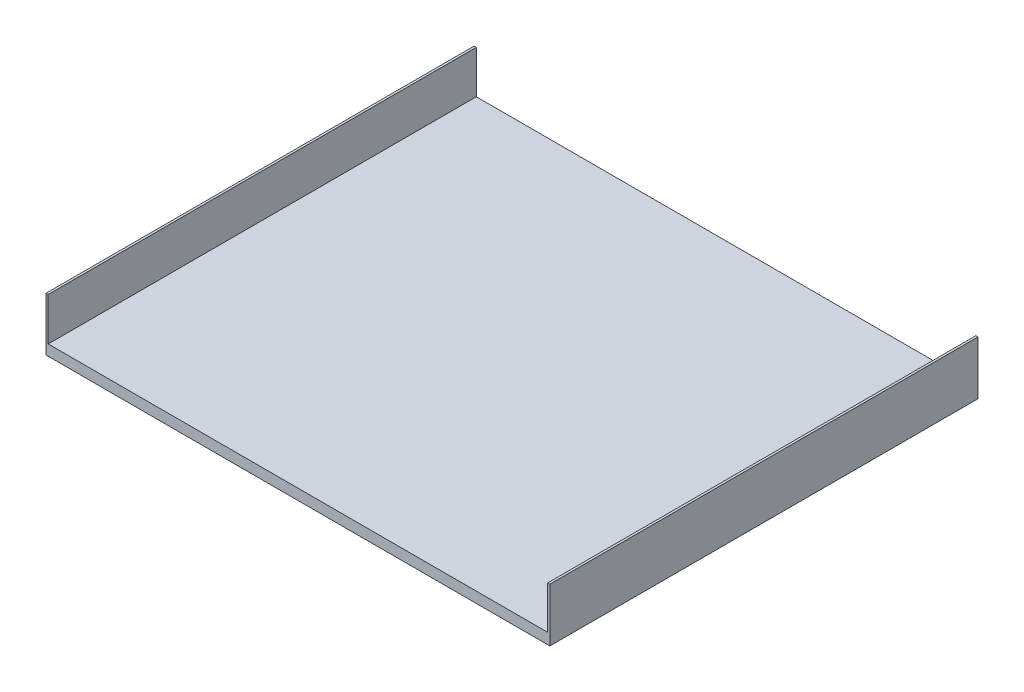
ISO-10303-21;
HEADER;
FILE_DESCRIPTION(('STEP AP214'),'2;1');
FILE_NAME('part.step','',(''),(''),'','','');
FILE_SCHEMA(('AUTOMOTIVE_DESIGN { 1 0 10303 214 1 1 1 1 }'));
ENDSEC;
DATA;
#1=APPLICATION_CONTEXT('core data for automotive mechanical design processes');
#2=APPLICATION_PROTOCOL_DEFINITION('international standard','automotive_design',2000,#1);
#3=PRODUCT_CONTEXT('',#1,'mechanical');
#4=PRODUCT('Part','Part','',(#3));
#5=PRODUCT_RELATED_PRODUCT_CATEGORY('part','',(#4));
#6=PRODUCT_DEFINITION_FORMATION('','',#4);
#7=PRODUCT_DEFINITION_CONTEXT('part definition',#1,'design');
#8=PRODUCT_DEFINITION('design','',#6,#7);
#9=PRODUCT_DEFINITION_SHAPE('','',#8);
#10=(LENGTH_UNIT() NAMED_UNIT(*) SI_UNIT(.MILLI.,.METRE.));
#11=(NAMED_UNIT(*) PLANE_ANGLE_UNIT() SI_UNIT($,.RADIAN.));
#12=(NAMED_UNIT(*) SI_UNIT($,.STERADIAN.) SOLID_ANGLE_UNIT());
#13=UNCERTAINTY_MEASURE_WITH_UNIT(LENGTH_MEASURE(1.E-05),#10,'distance_accuracy_value','');
#14=(GEOMETRIC_REPRESENTATION_CONTEXT(3) GLOBAL_UNCERTAINTY_ASSIGNED_CONTEXT((#13)) GLOBAL_UNIT_ASSIGNED_CONTEXT((#10,
#11,#12)) REPRESENTATION_CONTEXT('',''));
#15=CARTESIAN_POINT('',(0.,0.,0.));
#16=DIRECTION('',(0.,0.,1.));
#17=DIRECTION('',(1.,0.,0.));
#18=AXIS2_PLACEMENT_3D('',#15,#16,#17);
#19=CARTESIAN_POINT('',(0.,-15.,300.));
#20=DIRECTION('',(0.,1.,0.));
#21=DIRECTION('',(0.,0.,1.));
#22=AXIS2_PLACEMENT_3D('',#19,#20,#21);
#23=PLANE('',#22);
#24=DIRECTION('',(1.,0.,0.));
#25=VECTOR('',#24,1.);
#26=CARTESIAN_POINT('',(0.,-15.,-300.));
#27=LINE('',#26,#25);
#28=CARTESIAN_POINT('',(-353.0625,-15.,-300.));
#29=VERTEX_POINT('',#28);
#30=CARTESIAN_POINT('',(353.0625,-15.,-300.));
#31=VERTEX_POINT('',#30);
#32=EDGE_CURVE('E131',#29,#31,#27,.T.);
#33=ORIENTED_EDGE('',*,*,#32,.T.);
#34=DIRECTION('',(0.,0.,-1.));
#35=VECTOR('',#34,1.);
#36=CARTESIAN_POINT('',(353.0625,-15.,300.));
#37=LINE('',#36,#35);
#38=CARTESIAN_POINT('',(353.0625,-15.,300.));
#39=VERTEX_POINT('',#38);
#40=EDGE_CURVE('E11',#39,#31,#37,.T.);
#41=ORIENTED_EDGE('',*,*,#40,.F.);
#42=DIRECTION('',(1.,0.,0.));
#43=VECTOR('',#42,1.);
#44=CARTESIAN_POINT('',(0.,-15.,300.));
#45=LINE('',#44,#43);
#46=CARTESIAN_POINT('',(-353.0625,-15.,300.));
#47=VERTEX_POINT('',#46);
#48=EDGE_CURVE('E91',#47,#39,#45,.T.);
#49=ORIENTED_EDGE('',*,*,#48,.F.);
#50=DIRECTION('',(0.,0.,-1.));
#51=VECTOR('',#50,1.);
#52=CARTESIAN_POINT('',(-353.0625,-15.,300.));
#53=LINE('',#52,#51);
#54=EDGE_CURVE('E127',#47,#29,#53,.T.);
#55=ORIENTED_EDGE('',*,*,#54,.T.);
#56=EDGE_LOOP('',(#33,#41,#49,#55));
#57=FACE_BOUND('',#56,.T.);
#58=ADVANCED_FACE('F35',(#57),#23,.F.);
#59=CARTESIAN_POINT('',(353.0625,2.61318744421146E-13,300.));
#60=DIRECTION('',(1.,0.,0.));
#61=DIRECTION('',(0.,1.,0.));
#62=AXIS2_PLACEMENT_3D('',#59,#60,#61);
#63=PLANE('',#62);
#64=DIRECTION('',(0.,-1.,0.));
#65=VECTOR('',#64,1.);
#66=CARTESIAN_POINT('',(353.0625,2.61318744421146E-13,-300.));
#67=LINE('',#66,#65);
#68=CARTESIAN_POINT('',(353.0625,60.,-300.));
#69=VERTEX_POINT('',#68);
#70=EDGE_CURVE('E134',#69,#31,#67,.T.);
#71=ORIENTED_EDGE('',*,*,#70,.F.);
#72=DIRECTION('',(0.,0.,-1.));
#73=VECTOR('',#72,1.);
#74=CARTESIAN_POINT('',(353.0625,60.,300.));
#75=LINE('',#74,#73);
#76=CARTESIAN_POINT('',(353.0625,60.,300.));
#77=VERTEX_POINT('',#76);
#78=EDGE_CURVE('E43',#77,#69,#75,.T.);
#79=ORIENTED_EDGE('',*,*,#78,.F.);
#80=DIRECTION('',(0.,-1.,0.));
#81=VECTOR('',#80,1.);
#82=CARTESIAN_POINT('',(353.0625,2.61318744421146E-13,300.));
#83=LINE('',#82,#81);
#84=EDGE_CURVE('E173',#77,#39,#83,.T.);
#85=ORIENTED_EDGE('',*,*,#84,.T.);
#86=ORIENTED_EDGE('',*,*,#40,.T.);
#87=EDGE_LOOP('',(#71,#79,#85,#86));
#88=FACE_BOUND('',#87,.T.);
#89=ADVANCED_FACE('F163',(#88),#63,.T.);
#90=CARTESIAN_POINT('',(0.,60.,300.));
#91=DIRECTION('',(0.,1.,0.));
#92=DIRECTION('',(0.,0.,1.));
#93=AXIS2_PLACEMENT_3D('',#90,#91,#92);
#94=PLANE('',#93);
#95=DIRECTION('',(1.,0.,0.));
#96=VECTOR('',#95,1.);
#97=CARTESIAN_POINT('',(0.,60.,-300.));
#98=LINE('',#97,#96);
#99=CARTESIAN_POINT('',(350.,60.,-300.));
#100=VERTEX_POINT('',#99);
#101=EDGE_CURVE('E137',#100,#69,#98,.T.);
#102=ORIENTED_EDGE('',*,*,#101,.F.);
#103=DIRECTION('',(0.,0.,-1.));
#104=VECTOR('',#103,1.);
#105=CARTESIAN_POINT('',(350.,60.,300.));
#106=LINE('',#105,#104);
#107=CARTESIAN_POINT('',(350.,60.,300.));
#108=VERTEX_POINT('',#107);
#109=EDGE_CURVE('E153',#108,#100,#106,.T.);
#110=ORIENTED_EDGE('',*,*,#109,.F.);
#111=DIRECTION('',(1.,0.,0.));
#112=VECTOR('',#111,1.);
#113=CARTESIAN_POINT('',(0.,60.,300.));
#114=LINE('',#113,#112);
#115=EDGE_CURVE('E160',#108,#77,#114,.T.);
#116=ORIENTED_EDGE('',*,*,#115,.T.);
#117=ORIENTED_EDGE('',*,*,#78,.T.);
#118=EDGE_LOOP('',(#102,#110,#116,#117));
#119=FACE_BOUND('',#118,.T.);
#120=ADVANCED_FACE('F158',(#119),#94,.T.);
#121=CARTESIAN_POINT('',(350.,0.,300.));
#122=DIRECTION('',(-1.,0.,0.));
#123=DIRECTION('',(0.,0.,1.));
#124=AXIS2_PLACEMENT_3D('',#121,#122,#123);
#125=PLANE('',#124);
#126=DIRECTION('',(0.,1.,0.));
#127=VECTOR('',#126,1.);
#128=CARTESIAN_POINT('',(350.,0.,-300.));
#129=LINE('',#128,#127);
#130=CARTESIAN_POINT('',(350.,0.,-300.));
#131=VERTEX_POINT('',#130);
#132=EDGE_CURVE('E140',#131,#100,#129,.T.);
#133=ORIENTED_EDGE('',*,*,#132,.F.);
#134=DIRECTION('',(0.,0.,-1.));
#135=VECTOR('',#134,1.);
#136=CARTESIAN_POINT('',(350.,0.,300.));
#137=LINE('',#136,#135);
#138=CARTESIAN_POINT('',(350.,0.,300.));
#139=VERTEX_POINT('',#138);
#140=EDGE_CURVE('E151',#139,#131,#137,.T.);
#141=ORIENTED_EDGE('',*,*,#140,.F.);
#142=DIRECTION('',(0.,1.,0.));
#143=VECTOR('',#142,1.);
#144=CARTESIAN_POINT('',(350.,0.,300.));
#145=LINE('',#144,#143);
#146=EDGE_CURVE('E172',#139,#108,#145,.T.);
#147=ORIENTED_EDGE('',*,*,#146,.T.);
#148=ORIENTED_EDGE('',*,*,#109,.T.);
#149=EDGE_LOOP('',(#133,#141,#147,#148));
#150=FACE_BOUND('',#149,.T.);
#151=ADVANCED_FACE('F170',(#150),#125,.T.);
#152=CARTESIAN_POINT('',(0.,0.,300.));
#153=DIRECTION('',(0.,-1.,0.));
#154=DIRECTION('',(0.,0.,-1.));
#155=AXIS2_PLACEMENT_3D('',#152,#153,#154);
#156=PLANE('',#155);
#157=DIRECTION('',(-1.,0.,0.));
#158=VECTOR('',#157,1.);
#159=CARTESIAN_POINT('',(0.,0.,-300.));
#160=LINE('',#159,#158);
#161=CARTESIAN_POINT('',(-350.,0.,-300.));
#162=VERTEX_POINT('',#161);
#163=EDGE_CURVE('E143',#131,#162,#160,.T.);
#164=ORIENTED_EDGE('',*,*,#163,.T.);
#165=DIRECTION('',(0.,0.,-1.));
#166=VECTOR('',#165,1.);
#167=CARTESIAN_POINT('',(-350.,0.,300.));
#168=LINE('',#167,#166);
#169=CARTESIAN_POINT('',(-350.,0.,300.));
#170=VERTEX_POINT('',#169);
#171=EDGE_CURVE('E122',#170,#162,#168,.T.);
#172=ORIENTED_EDGE('',*,*,#171,.F.);
#173=DIRECTION('',(-1.,0.,0.));
#174=VECTOR('',#173,1.);
#175=CARTESIAN_POINT('',(0.,0.,300.));
#176=LINE('',#175,#174);
#177=EDGE_CURVE('E113',#139,#170,#176,.T.);
#178=ORIENTED_EDGE('',*,*,#177,.F.);
#179=ORIENTED_EDGE('',*,*,#140,.T.);
#180=EDGE_LOOP('',(#164,#172,#178,#179));
#181=FACE_BOUND('',#180,.T.);
#182=ADVANCED_FACE('F179',(#181),#156,.F.);
#183=CARTESIAN_POINT('',(-350.,0.,300.));
#184=DIRECTION('',(-1.,0.,0.));
#185=DIRECTION('',(0.,0.,1.));
#186=AXIS2_PLACEMENT_3D('',#183,#184,#185);
#187=PLANE('',#186);
#188=DIRECTION('',(0.,1.,0.));
#189=VECTOR('',#188,1.);
#190=CARTESIAN_POINT('',(-350.,0.,-300.));
#191=LINE('',#190,#189);
#192=CARTESIAN_POINT('',(-350.,60.,-300.));
#193=VERTEX_POINT('',#192);
#194=EDGE_CURVE('E121',#162,#193,#191,.T.);
#195=ORIENTED_EDGE('',*,*,#194,.T.);
#196=DIRECTION('',(0.,0.,-1.));
#197=VECTOR('',#196,1.);
#198=CARTESIAN_POINT('',(-350.,60.,300.));
#199=LINE('',#198,#197);
#200=CARTESIAN_POINT('',(-350.,60.,300.));
#201=VERTEX_POINT('',#200);
#202=EDGE_CURVE('E118',#201,#193,#199,.T.);
#203=ORIENTED_EDGE('',*,*,#202,.F.);
#204=DIRECTION('',(0.,1.,0.));
#205=VECTOR('',#204,1.);
#206=CARTESIAN_POINT('',(-350.,0.,300.));
#207=LINE('',#206,#205);
#208=EDGE_CURVE('E106',#170,#201,#207,.T.);
#209=ORIENTED_EDGE('',*,*,#208,.F.);
#210=ORIENTED_EDGE('',*,*,#171,.T.);
#211=EDGE_LOOP('',(#195,#203,#209,#210));
#212=FACE_BOUND('',#211,.T.);
#213=ADVANCED_FACE('F119',(#212),#187,.F.);
#214=CARTESIAN_POINT('',(0.,60.,300.));
#215=DIRECTION('',(0.,-1.,0.));
#216=DIRECTION('',(0.,0.,-1.));
#217=AXIS2_PLACEMENT_3D('',#214,#215,#216);
#218=PLANE('',#217);
#219=DIRECTION('',(-1.,0.,0.));
#220=VECTOR('',#219,1.);
#221=CARTESIAN_POINT('',(0.,60.,-300.));
#222=LINE('',#221,#220);
#223=CARTESIAN_POINT('',(-353.0625,60.,-300.));
#224=VERTEX_POINT('',#223);
#225=EDGE_CURVE('E79',#193,#224,#222,.T.);
#226=ORIENTED_EDGE('',*,*,#225,.T.);
#227=DIRECTION('',(0.,0.,-1.));
#228=VECTOR('',#227,1.);
#229=CARTESIAN_POINT('',(-353.0625,60.,300.));
#230=LINE('',#229,#228);
#231=CARTESIAN_POINT('',(-353.0625,60.,300.));
#232=VERTEX_POINT('',#231);
#233=EDGE_CURVE('E123',#232,#224,#230,.T.);
#234=ORIENTED_EDGE('',*,*,#233,.F.);
#235=DIRECTION('',(-1.,0.,0.));
#236=VECTOR('',#235,1.);
#237=CARTESIAN_POINT('',(0.,60.,300.));
#238=LINE('',#237,#236);
#239=EDGE_CURVE('E110',#201,#232,#238,.T.);
#240=ORIENTED_EDGE('',*,*,#239,.F.);
#241=ORIENTED_EDGE('',*,*,#202,.T.);
#242=EDGE_LOOP('',(#226,#234,#240,#241));
#243=FACE_BOUND('',#242,.T.);
#244=ADVANCED_FACE('F125',(#243),#218,.F.);
#245=CARTESIAN_POINT('',(-353.0625,2.61318744421146E-13,300.));
#246=DIRECTION('',(1.,0.,0.));
#247=DIRECTION('',(0.,1.,0.));
#248=AXIS2_PLACEMENT_3D('',#245,#246,#247);
#249=PLANE('',#248);
#250=DIRECTION('',(0.,-1.,0.));
#251=VECTOR('',#250,1.);
#252=CARTESIAN_POINT('',(-353.0625,2.61318744421146E-13,-300.));
#253=LINE('',#252,#251);
#254=EDGE_CURVE('E85',#224,#29,#253,.T.);
#255=ORIENTED_EDGE('',*,*,#254,.T.);
#256=ORIENTED_EDGE('',*,*,#54,.F.);
#257=DIRECTION('',(0.,-1.,0.));
#258=VECTOR('',#257,1.);
#259=CARTESIAN_POINT('',(-353.0625,2.61318744421146E-13,300.));
#260=LINE('',#259,#258);
#261=EDGE_CURVE('E51',#232,#47,#260,.T.);
#262=ORIENTED_EDGE('',*,*,#261,.F.);
#263=ORIENTED_EDGE('',*,*,#233,.T.);
#264=EDGE_LOOP('',(#255,#256,#262,#263));
#265=FACE_BOUND('',#264,.T.);
#266=ADVANCED_FACE('F181',(#265),#249,.F.);
#267=CARTESIAN_POINT('',(0.,0.,300.));
#268=DIRECTION('',(0.,0.,1.));
#269=DIRECTION('',(1.,0.,0.));
#270=AXIS2_PLACEMENT_3D('',#267,#268,#269);
#271=PLANE('',#270);
#272=ORIENTED_EDGE('',*,*,#48,.T.);
#273=ORIENTED_EDGE('',*,*,#84,.F.);
#274=ORIENTED_EDGE('',*,*,#115,.F.);
#275=ORIENTED_EDGE('',*,*,#146,.F.);
#276=ORIENTED_EDGE('',*,*,#177,.T.);
#277=ORIENTED_EDGE('',*,*,#208,.T.);
#278=ORIENTED_EDGE('',*,*,#239,.T.);
#279=ORIENTED_EDGE('',*,*,#261,.T.);
#280=EDGE_LOOP('',(#272,#273,#274,#275,#276,#277,#278,#279));
#281=FACE_BOUND('',#280,.T.);
#282=ADVANCED_FACE('F108',(#281),#271,.T.);
#283=CARTESIAN_POINT('',(0.,0.,-300.));
#284=DIRECTION('',(0.,0.,1.));
#285=DIRECTION('',(1.,0.,0.));
#286=AXIS2_PLACEMENT_3D('',#283,#284,#285);
#287=PLANE('',#286);
#288=ORIENTED_EDGE('',*,*,#32,.F.);
#289=ORIENTED_EDGE('',*,*,#254,.F.);
#290=ORIENTED_EDGE('',*,*,#225,.F.);
#291=ORIENTED_EDGE('',*,*,#194,.F.);
#292=ORIENTED_EDGE('',*,*,#163,.F.);
#293=ORIENTED_EDGE('',*,*,#132,.T.);
#294=ORIENTED_EDGE('',*,*,#101,.T.);
#295=ORIENTED_EDGE('',*,*,#70,.T.);
#296=EDGE_LOOP('',(#288,#289,#290,#291,#292,#293,#294,#295));
#297=FACE_BOUND('',#296,.T.);
#298=ADVANCED_FACE('F166',(#297),#287,.F.);
#299=CLOSED_SHELL('',(#58,#89,#120,#151,#182,#213,#244,#266,#282,#298));
#300=MANIFOLD_SOLID_BREP('B2',#299);
#301=ADVANCED_BREP_SHAPE_REPRESENTATION('',(#18,#300),#14);
#302=SHAPE_DEFINITION_REPRESENTATION(#9,#301);
ENDSEC;
END-ISO-10303-21;
